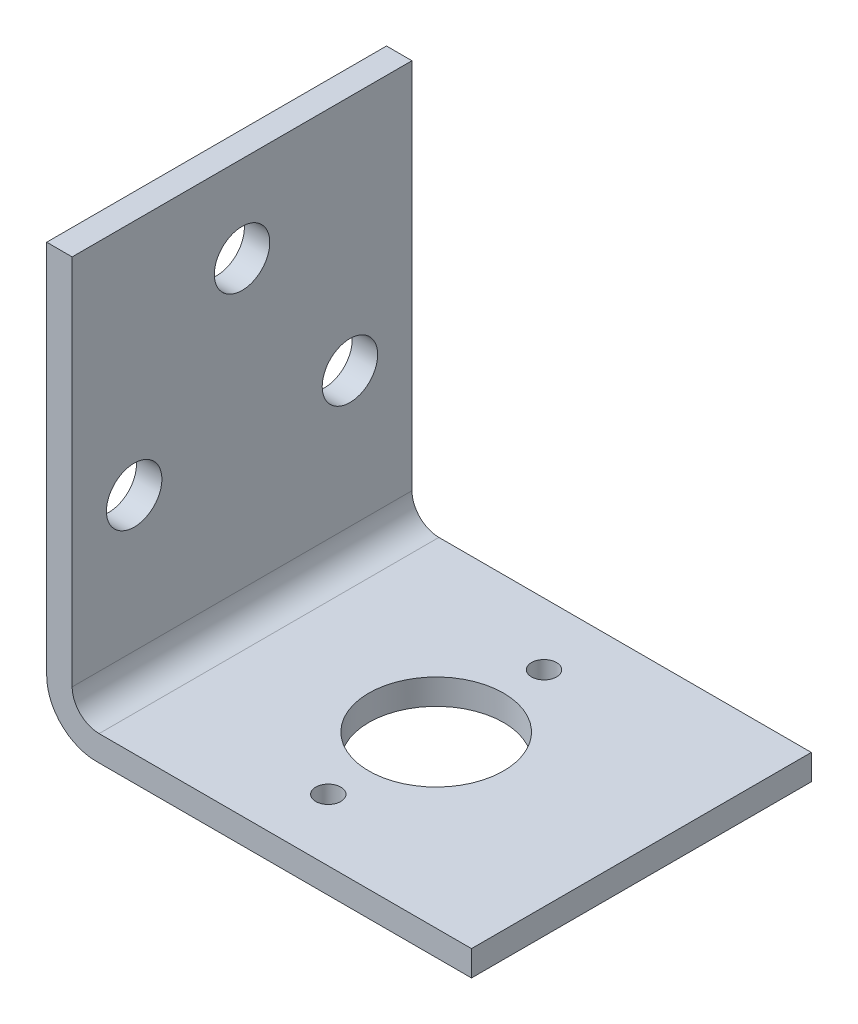
ISO-10303-21;
HEADER;
FILE_DESCRIPTION(('STEP AP214'),'2;1');
FILE_NAME('part.step','',(''),(''),'','','');
FILE_SCHEMA(('AUTOMOTIVE_DESIGN { 1 0 10303 214 1 1 1 1 }'));
ENDSEC;
DATA;
#1=APPLICATION_CONTEXT('core data for automotive mechanical design processes');
#2=APPLICATION_PROTOCOL_DEFINITION('international standard','automotive_design',2000,#1);
#3=PRODUCT_CONTEXT('',#1,'mechanical');
#4=PRODUCT('Part','Part','',(#3));
#5=PRODUCT_RELATED_PRODUCT_CATEGORY('part','',(#4));
#6=PRODUCT_DEFINITION_FORMATION('','',#4);
#7=PRODUCT_DEFINITION_CONTEXT('part definition',#1,'design');
#8=PRODUCT_DEFINITION('design','',#6,#7);
#9=PRODUCT_DEFINITION_SHAPE('','',#8);
#10=(LENGTH_UNIT() NAMED_UNIT(*) SI_UNIT(.MILLI.,.METRE.));
#11=(NAMED_UNIT(*) PLANE_ANGLE_UNIT() SI_UNIT($,.RADIAN.));
#12=(NAMED_UNIT(*) SI_UNIT($,.STERADIAN.) SOLID_ANGLE_UNIT());
#13=UNCERTAINTY_MEASURE_WITH_UNIT(LENGTH_MEASURE(1.E-05),#10,'distance_accuracy_value','');
#14=(GEOMETRIC_REPRESENTATION_CONTEXT(3) GLOBAL_UNCERTAINTY_ASSIGNED_CONTEXT((#13)) GLOBAL_UNIT_ASSIGNED_CONTEXT((#10,
#11,#12)) REPRESENTATION_CONTEXT('',''));
#15=CARTESIAN_POINT('',(0.,0.,0.));
#16=DIRECTION('',(0.,0.,1.));
#17=DIRECTION('',(1.,0.,0.));
#18=AXIS2_PLACEMENT_3D('',#15,#16,#17);
#19=CARTESIAN_POINT('',(0.,50.0126,40.005));
#20=DIRECTION('',(0.,-1.,0.));
#21=DIRECTION('',(0.,0.,-1.));
#22=AXIS2_PLACEMENT_3D('',#19,#20,#21);
#23=PLANE('',#22);
#24=DIRECTION('',(-1.,0.,0.));
#25=VECTOR('',#24,1.);
#26=CARTESIAN_POINT('',(0.,50.0126,0.));
#27=LINE('',#26,#25);
#28=CARTESIAN_POINT('',(2.9972,50.0126,0.));
#29=VERTEX_POINT('',#28);
#30=CARTESIAN_POINT('',(0.,50.0126,0.));
#31=VERTEX_POINT('',#30);
#32=EDGE_CURVE('E132',#29,#31,#27,.T.);
#33=ORIENTED_EDGE('',*,*,#32,.T.);
#34=DIRECTION('',(0.,0.,-1.));
#35=VECTOR('',#34,1.);
#36=CARTESIAN_POINT('',(0.,50.0126,40.005));
#37=LINE('',#36,#35);
#38=CARTESIAN_POINT('',(0.,50.0126,40.005));
#39=VERTEX_POINT('',#38);
#40=EDGE_CURVE('E11',#39,#31,#37,.T.);
#41=ORIENTED_EDGE('',*,*,#40,.F.);
#42=DIRECTION('',(-1.,0.,0.));
#43=VECTOR('',#42,1.);
#44=CARTESIAN_POINT('',(0.,50.0126,40.005));
#45=LINE('',#44,#43);
#46=CARTESIAN_POINT('',(2.9972,50.0126,40.005));
#47=VERTEX_POINT('',#46);
#48=EDGE_CURVE('E147',#47,#39,#45,.T.);
#49=ORIENTED_EDGE('',*,*,#48,.F.);
#50=DIRECTION('',(0.,0.,-1.));
#51=VECTOR('',#50,1.);
#52=CARTESIAN_POINT('',(2.9972,50.0126,40.005));
#53=LINE('',#52,#51);
#54=EDGE_CURVE('E128',#47,#29,#53,.T.);
#55=ORIENTED_EDGE('',*,*,#54,.T.);
#56=EDGE_LOOP('',(#33,#41,#49,#55));
#57=FACE_BOUND('',#56,.T.);
#58=ADVANCED_FACE('F34',(#57),#23,.F.);
#59=CARTESIAN_POINT('',(0.,5.84200000000004,40.005));
#60=DIRECTION('',(1.,0.,0.));
#61=DIRECTION('',(0.,0.,-1.));
#62=AXIS2_PLACEMENT_3D('',#59,#60,#61);
#63=PLANE('',#62);
#64=CARTESIAN_POINT('',(0.,22.0726,32.7025));
#65=DIRECTION('',(-1.,0.,0.));
#66=DIRECTION('',(0.,0.,1.));
#67=AXIS2_PLACEMENT_3D('',#64,#65,#66);
#68=CIRCLE('',#67,3.2639);
#69=CARTESIAN_POINT('',(0.,22.0726,35.9664));
#70=VERTEX_POINT('',#69);
#71=EDGE_CURVE('E175',#70,#70,#68,.T.);
#72=ORIENTED_EDGE('',*,*,#71,.F.);
#73=EDGE_LOOP('',(#72));
#74=FACE_BOUND('',#73,.T.);
#75=CARTESIAN_POINT('',(0.,39.8526,20.0025));
#76=DIRECTION('',(-1.,0.,0.));
#77=DIRECTION('',(0.,0.,1.));
#78=AXIS2_PLACEMENT_3D('',#75,#76,#77);
#79=CIRCLE('',#78,3.2639);
#80=CARTESIAN_POINT('',(0.,39.8526,23.2664));
#81=VERTEX_POINT('',#80);
#82=EDGE_CURVE('E180',#81,#81,#79,.T.);
#83=ORIENTED_EDGE('',*,*,#82,.F.);
#84=EDGE_LOOP('',(#83));
#85=FACE_BOUND('',#84,.T.);
#86=CARTESIAN_POINT('',(0.,22.0726,7.3025));
#87=DIRECTION('',(-1.,0.,0.));
#88=DIRECTION('',(0.,0.,1.));
#89=AXIS2_PLACEMENT_3D('',#86,#87,#88);
#90=CIRCLE('',#89,3.2639);
#91=CARTESIAN_POINT('',(0.,22.0726,10.5664));
#92=VERTEX_POINT('',#91);
#93=EDGE_CURVE('E172',#92,#92,#90,.T.);
#94=ORIENTED_EDGE('',*,*,#93,.F.);
#95=EDGE_LOOP('',(#94));
#96=FACE_BOUND('',#95,.T.);
#97=DIRECTION('',(0.,-1.,0.));
#98=VECTOR('',#97,1.);
#99=CARTESIAN_POINT('',(0.,5.84200000000004,0.));
#100=LINE('',#99,#98);
#101=CARTESIAN_POINT('',(0.,5.84200000000004,0.));
#102=VERTEX_POINT('',#101);
#103=EDGE_CURVE('E135',#31,#102,#100,.T.);
#104=ORIENTED_EDGE('',*,*,#103,.T.);
#105=DIRECTION('',(0.,0.,-1.));
#106=VECTOR('',#105,1.);
#107=CARTESIAN_POINT('',(0.,5.84200000000004,40.005));
#108=LINE('',#107,#106);
#109=CARTESIAN_POINT('',(0.,5.84200000000004,40.005));
#110=VERTEX_POINT('',#109);
#111=EDGE_CURVE('E43',#110,#102,#108,.T.);
#112=ORIENTED_EDGE('',*,*,#111,.F.);
#113=DIRECTION('',(0.,-1.,0.));
#114=VECTOR('',#113,1.);
#115=CARTESIAN_POINT('',(0.,5.84200000000004,40.005));
#116=LINE('',#115,#114);
#117=EDGE_CURVE('E95',#39,#110,#116,.T.);
#118=ORIENTED_EDGE('',*,*,#117,.F.);
#119=ORIENTED_EDGE('',*,*,#40,.T.);
#120=EDGE_LOOP('',(#104,#112,#118,#119));
#121=FACE_BOUND('',#120,.T.);
#122=ADVANCED_FACE('F231',(#74,#85,#96,#121),#63,.F.);
#123=CARTESIAN_POINT('',(5.842,5.842,40.005));
#124=DIRECTION('',(0.,0.,-1.));
#125=DIRECTION('',(-1.,0.,0.));
#126=AXIS2_PLACEMENT_3D('',#123,#124,#125);
#127=CYLINDRICAL_SURFACE('',#126,5.842);
#128=CARTESIAN_POINT('',(5.842,5.842,0.));
#129=DIRECTION('',(0.,0.,1.));
#130=DIRECTION('',(1.,0.,0.));
#131=AXIS2_PLACEMENT_3D('',#128,#129,#130);
#132=CIRCLE('',#131,5.842);
#133=CARTESIAN_POINT('',(5.84200000000004,0.,0.));
#134=VERTEX_POINT('',#133);
#135=EDGE_CURVE('E138',#102,#134,#132,.T.);
#136=ORIENTED_EDGE('',*,*,#135,.T.);
#137=DIRECTION('',(0.,0.,-1.));
#138=VECTOR('',#137,1.);
#139=CARTESIAN_POINT('',(5.84200000000004,0.,40.005));
#140=LINE('',#139,#138);
#141=CARTESIAN_POINT('',(5.84200000000004,0.,40.005));
#142=VERTEX_POINT('',#141);
#143=EDGE_CURVE('E154',#142,#134,#140,.T.);
#144=ORIENTED_EDGE('',*,*,#143,.F.);
#145=CARTESIAN_POINT('',(5.842,5.842,40.005));
#146=DIRECTION('',(0.,0.,1.));
#147=DIRECTION('',(1.,0.,0.));
#148=AXIS2_PLACEMENT_3D('',#145,#146,#147);
#149=CIRCLE('',#148,5.842);
#150=EDGE_CURVE('E197',#110,#142,#149,.T.);
#151=ORIENTED_EDGE('',*,*,#150,.F.);
#152=ORIENTED_EDGE('',*,*,#111,.T.);
#153=EDGE_LOOP('',(#136,#144,#151,#152));
#154=FACE_BOUND('',#153,.T.);
#155=ADVANCED_FACE('F235',(#154),#127,.T.);
#156=CARTESIAN_POINT('',(5.84200000000004,0.,40.005));
#157=DIRECTION('',(0.,1.,0.));
#158=DIRECTION('',(0.,0.,1.));
#159=AXIS2_PLACEMENT_3D('',#156,#157,#158);
#160=PLANE('',#159);
#161=CARTESIAN_POINT('',(25.85,0.,7.3025));
#162=DIRECTION('',(0.,1.,0.));
#163=DIRECTION('',(0.,0.,1.));
#164=AXIS2_PLACEMENT_3D('',#161,#162,#163);
#165=CIRCLE('',#164,1.4732);
#166=CARTESIAN_POINT('',(25.85,0.,8.7757));
#167=VERTEX_POINT('',#166);
#168=EDGE_CURVE('E162',#167,#167,#165,.T.);
#169=ORIENTED_EDGE('',*,*,#168,.T.);
#170=EDGE_LOOP('',(#169));
#171=FACE_BOUND('',#170,.T.);
#172=CARTESIAN_POINT('',(25.85,0.,20.0025));
#173=DIRECTION('',(0.,1.,0.));
#174=DIRECTION('',(0.,0.,1.));
#175=AXIS2_PLACEMENT_3D('',#172,#173,#174);
#176=CIRCLE('',#175,7.9375);
#177=CARTESIAN_POINT('',(25.85,0.,27.94));
#178=VERTEX_POINT('',#177);
#179=EDGE_CURVE('E166',#178,#178,#176,.T.);
#180=ORIENTED_EDGE('',*,*,#179,.T.);
#181=EDGE_LOOP('',(#180));
#182=FACE_BOUND('',#181,.T.);
#183=CARTESIAN_POINT('',(25.85,0.,32.7025));
#184=DIRECTION('',(0.,1.,0.));
#185=DIRECTION('',(0.,0.,1.));
#186=AXIS2_PLACEMENT_3D('',#183,#184,#185);
#187=CIRCLE('',#186,1.4732);
#188=CARTESIAN_POINT('',(25.85,0.,34.1757));
#189=VERTEX_POINT('',#188);
#190=EDGE_CURVE('E136',#189,#189,#187,.T.);
#191=ORIENTED_EDGE('',*,*,#190,.T.);
#192=EDGE_LOOP('',(#191));
#193=FACE_BOUND('',#192,.T.);
#194=DIRECTION('',(1.,0.,0.));
#195=VECTOR('',#194,1.);
#196=CARTESIAN_POINT('',(5.84200000000004,0.,0.));
#197=LINE('',#196,#195);
#198=CARTESIAN_POINT('',(50.0126,0.,0.));
#199=VERTEX_POINT('',#198);
#200=EDGE_CURVE('E140',#134,#199,#197,.T.);
#201=ORIENTED_EDGE('',*,*,#200,.T.);
#202=DIRECTION('',(0.,0.,-1.));
#203=VECTOR('',#202,1.);
#204=CARTESIAN_POINT('',(50.0126,0.,40.005));
#205=LINE('',#204,#203);
#206=CARTESIAN_POINT('',(50.0126,0.,40.005));
#207=VERTEX_POINT('',#206);
#208=EDGE_CURVE('E151',#207,#199,#205,.T.);
#209=ORIENTED_EDGE('',*,*,#208,.F.);
#210=DIRECTION('',(1.,0.,0.));
#211=VECTOR('',#210,1.);
#212=CARTESIAN_POINT('',(5.84200000000004,0.,40.005));
#213=LINE('',#212,#211);
#214=EDGE_CURVE('E199',#142,#207,#213,.T.);
#215=ORIENTED_EDGE('',*,*,#214,.F.);
#216=ORIENTED_EDGE('',*,*,#143,.T.);
#217=EDGE_LOOP('',(#201,#209,#215,#216));
#218=FACE_BOUND('',#217,.T.);
#219=ADVANCED_FACE('F205',(#171,#182,#193,#218),#160,.F.);
#220=CARTESIAN_POINT('',(50.0126,2.9972,40.005));
#221=DIRECTION('',(-1.,0.,0.));
#222=DIRECTION('',(0.,0.,1.));
#223=AXIS2_PLACEMENT_3D('',#220,#221,#222);
#224=PLANE('',#223);
#225=DIRECTION('',(0.,1.,0.));
#226=VECTOR('',#225,1.);
#227=CARTESIAN_POINT('',(50.0126,2.9972,0.));
#228=LINE('',#227,#226);
#229=CARTESIAN_POINT('',(50.0126,2.9972,0.));
#230=VERTEX_POINT('',#229);
#231=EDGE_CURVE('E142',#199,#230,#228,.T.);
#232=ORIENTED_EDGE('',*,*,#231,.T.);
#233=DIRECTION('',(0.,0.,-1.));
#234=VECTOR('',#233,1.);
#235=CARTESIAN_POINT('',(50.0126,2.9972,40.005));
#236=LINE('',#235,#234);
#237=CARTESIAN_POINT('',(50.0126,2.9972,40.005));
#238=VERTEX_POINT('',#237);
#239=EDGE_CURVE('E123',#238,#230,#236,.T.);
#240=ORIENTED_EDGE('',*,*,#239,.F.);
#241=DIRECTION('',(0.,1.,0.));
#242=VECTOR('',#241,1.);
#243=CARTESIAN_POINT('',(50.0126,2.9972,40.005));
#244=LINE('',#243,#242);
#245=EDGE_CURVE('E114',#207,#238,#244,.T.);
#246=ORIENTED_EDGE('',*,*,#245,.F.);
#247=ORIENTED_EDGE('',*,*,#208,.T.);
#248=EDGE_LOOP('',(#232,#240,#246,#247));
#249=FACE_BOUND('',#248,.T.);
#250=ADVANCED_FACE('F209',(#249),#224,.F.);
#251=CARTESIAN_POINT('',(6.1722,2.9972,40.005));
#252=DIRECTION('',(0.,-1.,0.));
#253=DIRECTION('',(0.,0.,-1.));
#254=AXIS2_PLACEMENT_3D('',#251,#252,#253);
#255=PLANE('',#254);
#256=CARTESIAN_POINT('',(25.85,2.9972,7.3025));
#257=DIRECTION('',(0.,-1.,0.));
#258=DIRECTION('',(0.,0.,-1.));
#259=AXIS2_PLACEMENT_3D('',#256,#257,#258);
#260=CIRCLE('',#259,1.4732);
#261=CARTESIAN_POINT('',(25.85,2.9972,5.8293));
#262=VERTEX_POINT('',#261);
#263=EDGE_CURVE('E168',#262,#262,#260,.T.);
#264=ORIENTED_EDGE('',*,*,#263,.T.);
#265=EDGE_LOOP('',(#264));
#266=FACE_BOUND('',#265,.T.);
#267=CARTESIAN_POINT('',(25.85,2.9972,20.0025));
#268=DIRECTION('',(0.,-1.,0.));
#269=DIRECTION('',(0.,0.,-1.));
#270=AXIS2_PLACEMENT_3D('',#267,#268,#269);
#271=CIRCLE('',#270,7.9375);
#272=CARTESIAN_POINT('',(25.85,2.9972,12.065));
#273=VERTEX_POINT('',#272);
#274=EDGE_CURVE('E163',#273,#273,#271,.T.);
#275=ORIENTED_EDGE('',*,*,#274,.T.);
#276=EDGE_LOOP('',(#275));
#277=FACE_BOUND('',#276,.T.);
#278=CARTESIAN_POINT('',(25.85,2.9972,32.7025));
#279=DIRECTION('',(0.,-1.,0.));
#280=DIRECTION('',(0.,0.,-1.));
#281=AXIS2_PLACEMENT_3D('',#278,#279,#280);
#282=CIRCLE('',#281,1.4732);
#283=CARTESIAN_POINT('',(25.85,2.9972,31.2293));
#284=VERTEX_POINT('',#283);
#285=EDGE_CURVE('E159',#284,#284,#282,.T.);
#286=ORIENTED_EDGE('',*,*,#285,.T.);
#287=EDGE_LOOP('',(#286));
#288=FACE_BOUND('',#287,.T.);
#289=DIRECTION('',(-1.,0.,0.));
#290=VECTOR('',#289,1.);
#291=CARTESIAN_POINT('',(6.1722,2.9972,0.));
#292=LINE('',#291,#290);
#293=CARTESIAN_POINT('',(6.1722,2.9972,0.));
#294=VERTEX_POINT('',#293);
#295=EDGE_CURVE('E122',#230,#294,#292,.T.);
#296=ORIENTED_EDGE('',*,*,#295,.T.);
#297=DIRECTION('',(0.,0.,-1.));
#298=VECTOR('',#297,1.);
#299=CARTESIAN_POINT('',(6.1722,2.9972,40.005));
#300=LINE('',#299,#298);
#301=CARTESIAN_POINT('',(6.1722,2.9972,40.005));
#302=VERTEX_POINT('',#301);
#303=EDGE_CURVE('E119',#302,#294,#300,.T.);
#304=ORIENTED_EDGE('',*,*,#303,.F.);
#305=DIRECTION('',(-1.,0.,0.));
#306=VECTOR('',#305,1.);
#307=CARTESIAN_POINT('',(6.1722,2.9972,40.005));
#308=LINE('',#307,#306);
#309=EDGE_CURVE('E108',#238,#302,#308,.T.);
#310=ORIENTED_EDGE('',*,*,#309,.F.);
#311=ORIENTED_EDGE('',*,*,#239,.T.);
#312=EDGE_LOOP('',(#296,#304,#310,#311));
#313=FACE_BOUND('',#312,.T.);
#314=ADVANCED_FACE('F120',(#266,#277,#288,#313),#255,.F.);
#315=CARTESIAN_POINT('',(6.1722,6.1722,40.005));
#316=DIRECTION('',(0.,0.,-1.));
#317=DIRECTION('',(-1.,0.,0.));
#318=AXIS2_PLACEMENT_3D('',#315,#316,#317);
#319=CYLINDRICAL_SURFACE('',#318,3.175);
#320=CARTESIAN_POINT('',(6.1722,6.1722,0.));
#321=DIRECTION('',(0.,0.,-1.));
#322=DIRECTION('',(-1.,0.,0.));
#323=AXIS2_PLACEMENT_3D('',#320,#321,#322);
#324=CIRCLE('',#323,3.175);
#325=CARTESIAN_POINT('',(2.9972,6.1722,0.));
#326=VERTEX_POINT('',#325);
#327=EDGE_CURVE('E81',#294,#326,#324,.T.);
#328=ORIENTED_EDGE('',*,*,#327,.T.);
#329=DIRECTION('',(0.,0.,-1.));
#330=VECTOR('',#329,1.);
#331=CARTESIAN_POINT('',(2.9972,6.1722,40.005));
#332=LINE('',#331,#330);
#333=CARTESIAN_POINT('',(2.9972,6.1722,40.005));
#334=VERTEX_POINT('',#333);
#335=EDGE_CURVE('E124',#334,#326,#332,.T.);
#336=ORIENTED_EDGE('',*,*,#335,.F.);
#337=CARTESIAN_POINT('',(6.1722,6.1722,40.005));
#338=DIRECTION('',(0.,0.,-1.));
#339=DIRECTION('',(-1.,0.,0.));
#340=AXIS2_PLACEMENT_3D('',#337,#338,#339);
#341=CIRCLE('',#340,3.175);
#342=EDGE_CURVE('E112',#302,#334,#341,.T.);
#343=ORIENTED_EDGE('',*,*,#342,.F.);
#344=ORIENTED_EDGE('',*,*,#303,.T.);
#345=EDGE_LOOP('',(#328,#336,#343,#344));
#346=FACE_BOUND('',#345,.T.);
#347=ADVANCED_FACE('F126',(#346),#319,.F.);
#348=CARTESIAN_POINT('',(2.9972,6.1722,40.005));
#349=DIRECTION('',(-1.,0.,0.));
#350=DIRECTION('',(0.,0.,1.));
#351=AXIS2_PLACEMENT_3D('',#348,#349,#350);
#352=PLANE('',#351);
#353=CARTESIAN_POINT('',(2.9972,22.0726,32.7025));
#354=DIRECTION('',(-1.,0.,0.));
#355=DIRECTION('',(0.,0.,1.));
#356=AXIS2_PLACEMENT_3D('',#353,#354,#355);
#357=CIRCLE('',#356,3.2639);
#358=CARTESIAN_POINT('',(2.9972,22.0726,35.9664));
#359=VERTEX_POINT('',#358);
#360=EDGE_CURVE('E37',#359,#359,#357,.T.);
#361=ORIENTED_EDGE('',*,*,#360,.T.);
#362=EDGE_LOOP('',(#361));
#363=FACE_BOUND('',#362,.T.);
#364=CARTESIAN_POINT('',(2.9972,39.8526,20.0025));
#365=DIRECTION('',(-1.,0.,0.));
#366=DIRECTION('',(0.,0.,1.));
#367=AXIS2_PLACEMENT_3D('',#364,#365,#366);
#368=CIRCLE('',#367,3.2639);
#369=CARTESIAN_POINT('',(2.9972,39.8526,23.2664));
#370=VERTEX_POINT('',#369);
#371=EDGE_CURVE('E173',#370,#370,#368,.T.);
#372=ORIENTED_EDGE('',*,*,#371,.T.);
#373=EDGE_LOOP('',(#372));
#374=FACE_BOUND('',#373,.T.);
#375=CARTESIAN_POINT('',(2.9972,22.0726,7.3025));
#376=DIRECTION('',(-1.,0.,0.));
#377=DIRECTION('',(0.,0.,1.));
#378=AXIS2_PLACEMENT_3D('',#375,#376,#377);
#379=CIRCLE('',#378,3.2639);
#380=CARTESIAN_POINT('',(2.9972,22.0726,10.5664));
#381=VERTEX_POINT('',#380);
#382=EDGE_CURVE('E167',#381,#381,#379,.T.);
#383=ORIENTED_EDGE('',*,*,#382,.T.);
#384=EDGE_LOOP('',(#383));
#385=FACE_BOUND('',#384,.T.);
#386=DIRECTION('',(0.,1.,0.));
#387=VECTOR('',#386,1.);
#388=CARTESIAN_POINT('',(2.9972,6.1722,0.));
#389=LINE('',#388,#387);
#390=EDGE_CURVE('E87',#326,#29,#389,.T.);
#391=ORIENTED_EDGE('',*,*,#390,.T.);
#392=ORIENTED_EDGE('',*,*,#54,.F.);
#393=DIRECTION('',(0.,1.,0.));
#394=VECTOR('',#393,1.);
#395=CARTESIAN_POINT('',(2.9972,6.1722,40.005));
#396=LINE('',#395,#394);
#397=EDGE_CURVE('E52',#334,#47,#396,.T.);
#398=ORIENTED_EDGE('',*,*,#397,.F.);
#399=ORIENTED_EDGE('',*,*,#335,.T.);
#400=EDGE_LOOP('',(#391,#392,#398,#399));
#401=FACE_BOUND('',#400,.T.);
#402=ADVANCED_FACE('F217',(#363,#374,#385,#401),#352,.F.);
#403=CARTESIAN_POINT('',(6.1722,6.1722,40.005));
#404=DIRECTION('',(0.,0.,-1.));
#405=DIRECTION('',(-1.,0.,0.));
#406=AXIS2_PLACEMENT_3D('',#403,#404,#405);
#407=PLANE('',#406);
#408=ORIENTED_EDGE('',*,*,#48,.T.);
#409=ORIENTED_EDGE('',*,*,#117,.T.);
#410=ORIENTED_EDGE('',*,*,#150,.T.);
#411=ORIENTED_EDGE('',*,*,#214,.T.);
#412=ORIENTED_EDGE('',*,*,#245,.T.);
#413=ORIENTED_EDGE('',*,*,#309,.T.);
#414=ORIENTED_EDGE('',*,*,#342,.T.);
#415=ORIENTED_EDGE('',*,*,#397,.T.);
#416=EDGE_LOOP('',(#408,#409,#410,#411,#412,#413,#414,#415));
#417=FACE_BOUND('',#416,.T.);
#418=ADVANCED_FACE('F110',(#417),#407,.F.);
#419=CARTESIAN_POINT('',(6.1722,6.1722,0.));
#420=DIRECTION('',(0.,0.,-1.));
#421=DIRECTION('',(-1.,0.,0.));
#422=AXIS2_PLACEMENT_3D('',#419,#420,#421);
#423=PLANE('',#422);
#424=ORIENTED_EDGE('',*,*,#32,.F.);
#425=ORIENTED_EDGE('',*,*,#390,.F.);
#426=ORIENTED_EDGE('',*,*,#327,.F.);
#427=ORIENTED_EDGE('',*,*,#295,.F.);
#428=ORIENTED_EDGE('',*,*,#231,.F.);
#429=ORIENTED_EDGE('',*,*,#200,.F.);
#430=ORIENTED_EDGE('',*,*,#135,.F.);
#431=ORIENTED_EDGE('',*,*,#103,.F.);
#432=EDGE_LOOP('',(#424,#425,#426,#427,#428,#429,#430,#431));
#433=FACE_BOUND('',#432,.T.);
#434=ADVANCED_FACE('F212',(#433),#423,.T.);
#435=CARTESIAN_POINT('',(25.85,50.0126,32.7025));
#436=DIRECTION('',(0.,-1.,0.));
#437=DIRECTION('',(0.,0.,-1.));
#438=AXIS2_PLACEMENT_3D('',#435,#436,#437);
#439=CYLINDRICAL_SURFACE('',#438,1.4732);
#440=ORIENTED_EDGE('',*,*,#285,.F.);
#441=EDGE_LOOP('',(#440));
#442=FACE_BOUND('',#441,.T.);
#443=ORIENTED_EDGE('',*,*,#190,.F.);
#444=EDGE_LOOP('',(#443));
#445=FACE_BOUND('',#444,.T.);
#446=ADVANCED_FACE('F260',(#442,#445),#439,.F.);
#447=CARTESIAN_POINT('',(25.85,50.0126,20.0025));
#448=DIRECTION('',(0.,-1.,0.));
#449=DIRECTION('',(0.,0.,-1.));
#450=AXIS2_PLACEMENT_3D('',#447,#448,#449);
#451=CYLINDRICAL_SURFACE('',#450,7.9375);
#452=ORIENTED_EDGE('',*,*,#274,.F.);
#453=EDGE_LOOP('',(#452));
#454=FACE_BOUND('',#453,.T.);
#455=ORIENTED_EDGE('',*,*,#179,.F.);
#456=EDGE_LOOP('',(#455));
#457=FACE_BOUND('',#456,.T.);
#458=ADVANCED_FACE('F263',(#454,#457),#451,.F.);
#459=CARTESIAN_POINT('',(25.85,50.0126,7.3025));
#460=DIRECTION('',(0.,-1.,0.));
#461=DIRECTION('',(0.,0.,-1.));
#462=AXIS2_PLACEMENT_3D('',#459,#460,#461);
#463=CYLINDRICAL_SURFACE('',#462,1.4732);
#464=ORIENTED_EDGE('',*,*,#263,.F.);
#465=EDGE_LOOP('',(#464));
#466=FACE_BOUND('',#465,.T.);
#467=ORIENTED_EDGE('',*,*,#168,.F.);
#468=EDGE_LOOP('',(#467));
#469=FACE_BOUND('',#468,.T.);
#470=ADVANCED_FACE('F270',(#466,#469),#463,.F.);
#471=CARTESIAN_POINT('',(50.0126,22.0726,7.3025));
#472=DIRECTION('',(-1.,0.,0.));
#473=DIRECTION('',(0.,0.,1.));
#474=AXIS2_PLACEMENT_3D('',#471,#472,#473);
#475=CYLINDRICAL_SURFACE('',#474,3.2639);
#476=ORIENTED_EDGE('',*,*,#93,.T.);
#477=EDGE_LOOP('',(#476));
#478=FACE_BOUND('',#477,.T.);
#479=ORIENTED_EDGE('',*,*,#382,.F.);
#480=EDGE_LOOP('',(#479));
#481=FACE_BOUND('',#480,.T.);
#482=ADVANCED_FACE('F276',(#478,#481),#475,.F.);
#483=CARTESIAN_POINT('',(50.0126,39.8526,20.0025));
#484=DIRECTION('',(-1.,0.,0.));
#485=DIRECTION('',(0.,0.,1.));
#486=AXIS2_PLACEMENT_3D('',#483,#484,#485);
#487=CYLINDRICAL_SURFACE('',#486,3.2639);
#488=ORIENTED_EDGE('',*,*,#82,.T.);
#489=EDGE_LOOP('',(#488));
#490=FACE_BOUND('',#489,.T.);
#491=ORIENTED_EDGE('',*,*,#371,.F.);
#492=EDGE_LOOP('',(#491));
#493=FACE_BOUND('',#492,.T.);
#494=ADVANCED_FACE('F280',(#490,#493),#487,.F.);
#495=CARTESIAN_POINT('',(50.0126,22.0726,32.7025));
#496=DIRECTION('',(-1.,0.,0.));
#497=DIRECTION('',(0.,0.,1.));
#498=AXIS2_PLACEMENT_3D('',#495,#496,#497);
#499=CYLINDRICAL_SURFACE('',#498,3.2639);
#500=ORIENTED_EDGE('',*,*,#71,.T.);
#501=EDGE_LOOP('',(#500));
#502=FACE_BOUND('',#501,.T.);
#503=ORIENTED_EDGE('',*,*,#360,.F.);
#504=EDGE_LOOP('',(#503));
#505=FACE_BOUND('',#504,.T.);
#506=ADVANCED_FACE('F284',(#502,#505),#499,.F.);
#507=CLOSED_SHELL('',(#58,#122,#155,#219,#250,#314,#347,#402,#418,#434,#446,#458,#470,#482,#494,#506));
#508=MANIFOLD_SOLID_BREP('B2',#507);
#509=ADVANCED_BREP_SHAPE_REPRESENTATION('',(#18,#508),#14);
#510=SHAPE_DEFINITION_REPRESENTATION(#9,#509);
ENDSEC;
END-ISO-10303-21;
